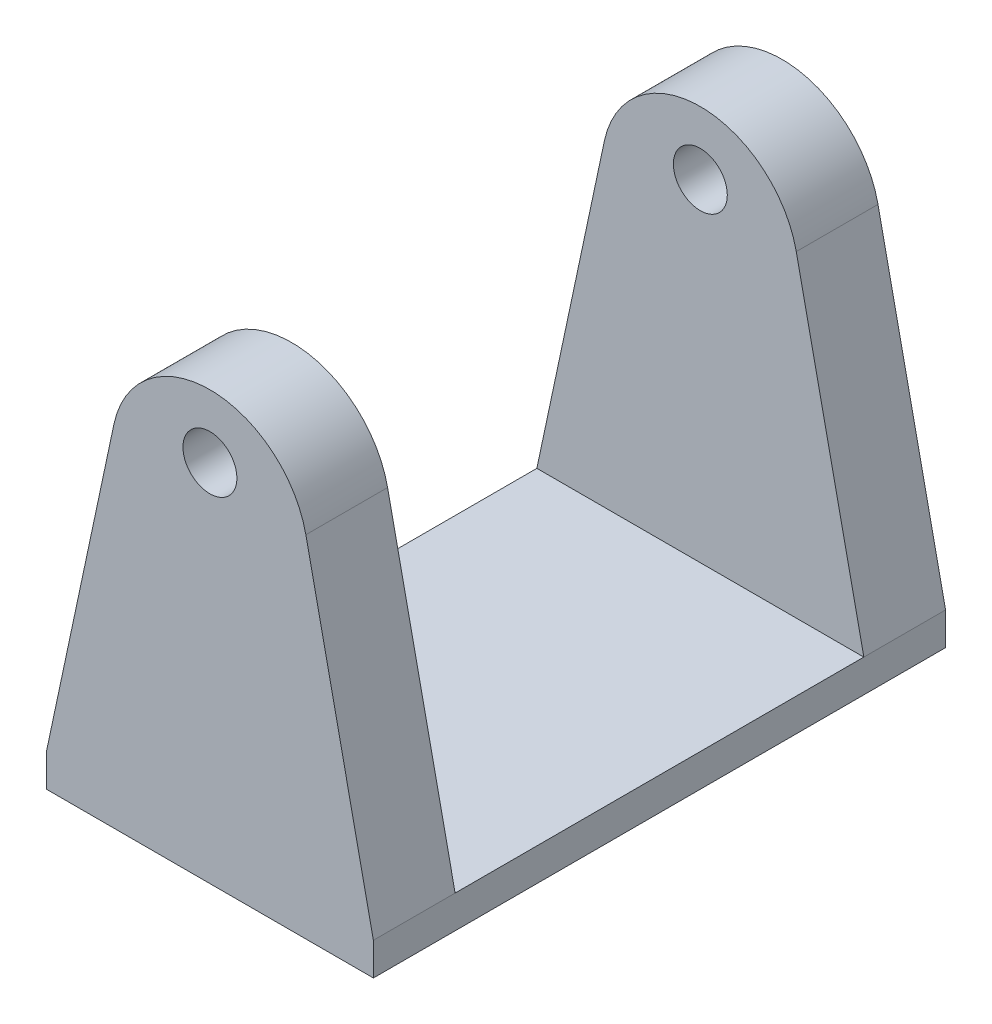
ISO-10303-21;
HEADER;
FILE_DESCRIPTION(('STEP AP214'),'2;1');
FILE_NAME('part.step','',(''),(''),'','','');
FILE_SCHEMA(('AUTOMOTIVE_DESIGN { 1 0 10303 214 1 1 1 1 }'));
ENDSEC;
DATA;
#1=APPLICATION_CONTEXT('core data for automotive mechanical design processes');
#2=APPLICATION_PROTOCOL_DEFINITION('international standard','automotive_design',2000,#1);
#3=PRODUCT_CONTEXT('',#1,'mechanical');
#4=PRODUCT('Part','Part','',(#3));
#5=PRODUCT_RELATED_PRODUCT_CATEGORY('part','',(#4));
#6=PRODUCT_DEFINITION_FORMATION('','',#4);
#7=PRODUCT_DEFINITION_CONTEXT('part definition',#1,'design');
#8=PRODUCT_DEFINITION('design','',#6,#7);
#9=PRODUCT_DEFINITION_SHAPE('','',#8);
#10=(LENGTH_UNIT() NAMED_UNIT(*) SI_UNIT(.MILLI.,.METRE.));
#11=(NAMED_UNIT(*) PLANE_ANGLE_UNIT() SI_UNIT($,.RADIAN.));
#12=(NAMED_UNIT(*) SI_UNIT($,.STERADIAN.) SOLID_ANGLE_UNIT());
#13=UNCERTAINTY_MEASURE_WITH_UNIT(LENGTH_MEASURE(1.E-05),#10,'distance_accuracy_value','');
#14=(GEOMETRIC_REPRESENTATION_CONTEXT(3) GLOBAL_UNCERTAINTY_ASSIGNED_CONTEXT((#13)) GLOBAL_UNIT_ASSIGNED_CONTEXT((#10,
#11,#12)) REPRESENTATION_CONTEXT('',''));
#15=CARTESIAN_POINT('',(0.,0.,0.));
#16=DIRECTION('',(0.,0.,1.));
#17=DIRECTION('',(1.,0.,0.));
#18=AXIS2_PLACEMENT_3D('',#15,#16,#17);
#19=CARTESIAN_POINT('',(0.,2.,0.));
#20=DIRECTION('',(0.,-1.,0.));
#21=DIRECTION('',(0.,0.,-1.));
#22=AXIS2_PLACEMENT_3D('',#19,#20,#21);
#23=PLANE('',#22);
#24=DIRECTION('',(1.,0.,0.));
#25=VECTOR('',#24,1.);
#26=CARTESIAN_POINT('',(0.,2.,-30.));
#27=LINE('',#26,#25);
#28=CARTESIAN_POINT('',(0.,2.,-30.));
#29=VERTEX_POINT('',#28);
#30=CARTESIAN_POINT('',(20.,2.,-30.));
#31=VERTEX_POINT('',#30);
#32=EDGE_CURVE('E147',#29,#31,#27,.T.);
#33=ORIENTED_EDGE('',*,*,#32,.F.);
#34=DIRECTION('',(0.,0.,1.));
#35=VECTOR('',#34,1.);
#36=CARTESIAN_POINT('',(0.,2.,0.));
#37=LINE('',#36,#35);
#38=CARTESIAN_POINT('',(0.,2.,-5.));
#39=VERTEX_POINT('',#38);
#40=EDGE_CURVE('E258',#29,#39,#37,.T.);
#41=ORIENTED_EDGE('',*,*,#40,.T.);
#42=DIRECTION('',(1.,0.,0.));
#43=VECTOR('',#42,1.);
#44=CARTESIAN_POINT('',(0.,2.,-5.));
#45=LINE('',#44,#43);
#46=CARTESIAN_POINT('',(20.,2.,-5.));
#47=VERTEX_POINT('',#46);
#48=EDGE_CURVE('E140',#39,#47,#45,.T.);
#49=ORIENTED_EDGE('',*,*,#48,.T.);
#50=DIRECTION('',(0.,0.,-1.));
#51=VECTOR('',#50,1.);
#52=CARTESIAN_POINT('',(20.,2.,0.));
#53=LINE('',#52,#51);
#54=EDGE_CURVE('E276',#47,#31,#53,.T.);
#55=ORIENTED_EDGE('',*,*,#54,.T.);
#56=EDGE_LOOP('',(#33,#41,#49,#55));
#57=FACE_BOUND('',#56,.T.);
#58=ADVANCED_FACE('F41',(#57),#23,.F.);
#59=CARTESIAN_POINT('',(0.,2.,0.));
#60=DIRECTION('',(1.,0.,0.));
#61=DIRECTION('',(0.,0.,-1.));
#62=AXIS2_PLACEMENT_3D('',#59,#60,#61);
#63=PLANE('',#62);
#64=DIRECTION('',(0.,0.,1.));
#65=VECTOR('',#64,1.);
#66=CARTESIAN_POINT('',(0.,0.,0.));
#67=LINE('',#66,#65);
#68=CARTESIAN_POINT('',(0.,0.,-35.));
#69=VERTEX_POINT('',#68);
#70=CARTESIAN_POINT('',(0.,0.,0.));
#71=VERTEX_POINT('',#70);
#72=EDGE_CURVE('E188',#69,#71,#67,.T.);
#73=ORIENTED_EDGE('',*,*,#72,.T.);
#74=DIRECTION('',(0.,-1.,0.));
#75=VECTOR('',#74,1.);
#76=CARTESIAN_POINT('',(0.,2.,0.));
#77=LINE('',#76,#75);
#78=CARTESIAN_POINT('',(0.,2.,0.));
#79=VERTEX_POINT('',#78);
#80=EDGE_CURVE('E208',#79,#71,#77,.T.);
#81=ORIENTED_EDGE('',*,*,#80,.F.);
#82=DIRECTION('',(0.,0.,-1.));
#83=VECTOR('',#82,1.);
#84=CARTESIAN_POINT('',(0.,2.,0.));
#85=LINE('',#84,#83);
#86=EDGE_CURVE('E236',#79,#39,#85,.T.);
#87=ORIENTED_EDGE('',*,*,#86,.T.);
#88=ORIENTED_EDGE('',*,*,#40,.F.);
#89=CARTESIAN_POINT('',(0.,2.,-35.));
#90=VERTEX_POINT('',#89);
#91=EDGE_CURVE('E254',#90,#29,#37,.T.);
#92=ORIENTED_EDGE('',*,*,#91,.F.);
#93=DIRECTION('',(0.,-1.,0.));
#94=VECTOR('',#93,1.);
#95=CARTESIAN_POINT('',(0.,2.,-35.));
#96=LINE('',#95,#94);
#97=EDGE_CURVE('E130',#90,#69,#96,.T.);
#98=ORIENTED_EDGE('',*,*,#97,.T.);
#99=EDGE_LOOP('',(#73,#81,#87,#88,#92,#98));
#100=FACE_BOUND('',#99,.T.);
#101=ADVANCED_FACE('F294',(#100),#63,.F.);
#102=CARTESIAN_POINT('',(0.,2.,0.));
#103=DIRECTION('',(0.,0.,-1.));
#104=DIRECTION('',(-1.,0.,0.));
#105=AXIS2_PLACEMENT_3D('',#102,#103,#104);
#106=PLANE('',#105);
#107=CARTESIAN_POINT('',(10.,22.3,0.));
#108=DIRECTION('',(0.,0.,-1.));
#109=DIRECTION('',(-1.,0.,0.));
#110=AXIS2_PLACEMENT_3D('',#107,#108,#109);
#111=CIRCLE('',#110,1.65);
#112=CARTESIAN_POINT('',(8.35,22.3,0.));
#113=VERTEX_POINT('',#112);
#114=EDGE_CURVE('E415',#113,#113,#111,.T.);
#115=ORIENTED_EDGE('',*,*,#114,.T.);
#116=EDGE_LOOP('',(#115));
#117=FACE_BOUND('',#116,.T.);
#118=DIRECTION('',(-0.208107644464859,0.978105928984836,0.));
#119=VECTOR('',#118,1.);
#120=CARTESIAN_POINT('',(20.,2.,0.));
#121=LINE('',#120,#119);
#122=CARTESIAN_POINT('',(20.,2.,0.));
#123=VERTEX_POINT('',#122);
#124=CARTESIAN_POINT('',(15.868635573909,21.4174128026276,0.));
#125=VERTEX_POINT('',#124);
#126=EDGE_CURVE('E184',#123,#125,#121,.T.);
#127=ORIENTED_EDGE('',*,*,#126,.T.);
#128=CARTESIAN_POINT('',(10.,20.1687669358385,0.));
#129=DIRECTION('',(0.,0.,-1.));
#130=DIRECTION('',(-1.,0.,0.));
#131=AXIS2_PLACEMENT_3D('',#128,#129,#130);
#132=CIRCLE('',#131,6.);
#133=CARTESIAN_POINT('',(4.13136442609099,21.4174128026276,0.));
#134=VERTEX_POINT('',#133);
#135=EDGE_CURVE('E172',#125,#134,#132,.F.);
#136=ORIENTED_EDGE('',*,*,#135,.T.);
#137=DIRECTION('',(-0.208107644464859,-0.978105928984835,0.));
#138=VECTOR('',#137,1.);
#139=CARTESIAN_POINT('',(10.,49.,0.));
#140=LINE('',#139,#138);
#141=EDGE_CURVE('E196',#134,#79,#140,.T.);
#142=ORIENTED_EDGE('',*,*,#141,.T.);
#143=ORIENTED_EDGE('',*,*,#80,.T.);
#144=DIRECTION('',(1.,0.,0.));
#145=VECTOR('',#144,1.);
#146=CARTESIAN_POINT('',(0.,0.,0.));
#147=LINE('',#146,#145);
#148=CARTESIAN_POINT('',(20.,0.,0.));
#149=VERTEX_POINT('',#148);
#150=EDGE_CURVE('E287',#71,#149,#147,.T.);
#151=ORIENTED_EDGE('',*,*,#150,.T.);
#152=DIRECTION('',(0.,-1.,0.));
#153=VECTOR('',#152,1.);
#154=CARTESIAN_POINT('',(20.,2.,0.));
#155=LINE('',#154,#153);
#156=EDGE_CURVE('E129',#123,#149,#155,.T.);
#157=ORIENTED_EDGE('',*,*,#156,.F.);
#158=EDGE_LOOP('',(#127,#136,#142,#143,#151,#157));
#159=FACE_BOUND('',#158,.T.);
#160=ADVANCED_FACE('F220',(#117,#159),#106,.F.);
#161=CARTESIAN_POINT('',(20.,2.,0.));
#162=DIRECTION('',(-1.,0.,0.));
#163=DIRECTION('',(0.,0.,1.));
#164=AXIS2_PLACEMENT_3D('',#161,#162,#163);
#165=PLANE('',#164);
#166=DIRECTION('',(0.,0.,-1.));
#167=VECTOR('',#166,1.);
#168=CARTESIAN_POINT('',(20.,0.,0.));
#169=LINE('',#168,#167);
#170=CARTESIAN_POINT('',(20.,0.,-35.));
#171=VERTEX_POINT('',#170);
#172=EDGE_CURVE('E125',#149,#171,#169,.T.);
#173=ORIENTED_EDGE('',*,*,#172,.T.);
#174=DIRECTION('',(0.,-1.,0.));
#175=VECTOR('',#174,1.);
#176=CARTESIAN_POINT('',(20.,2.,-35.));
#177=LINE('',#176,#175);
#178=CARTESIAN_POINT('',(20.,2.,-35.));
#179=VERTEX_POINT('',#178);
#180=EDGE_CURVE('E116',#179,#171,#177,.T.);
#181=ORIENTED_EDGE('',*,*,#180,.F.);
#182=DIRECTION('',(0.,0.,1.));
#183=VECTOR('',#182,1.);
#184=CARTESIAN_POINT('',(20.,2.,-35.));
#185=LINE('',#184,#183);
#186=EDGE_CURVE('E121',#179,#31,#185,.T.);
#187=ORIENTED_EDGE('',*,*,#186,.T.);
#188=ORIENTED_EDGE('',*,*,#54,.F.);
#189=EDGE_CURVE('E269',#123,#47,#53,.T.);
#190=ORIENTED_EDGE('',*,*,#189,.F.);
#191=ORIENTED_EDGE('',*,*,#156,.T.);
#192=EDGE_LOOP('',(#173,#181,#187,#188,#190,#191));
#193=FACE_BOUND('',#192,.T.);
#194=ADVANCED_FACE('F118',(#193),#165,.F.);
#195=CARTESIAN_POINT('',(0.,2.,-35.));
#196=DIRECTION('',(0.,0.,1.));
#197=DIRECTION('',(1.,0.,0.));
#198=AXIS2_PLACEMENT_3D('',#195,#196,#197);
#199=PLANE('',#198);
#200=CARTESIAN_POINT('',(10.,22.3,-35.));
#201=DIRECTION('',(0.,0.,1.));
#202=DIRECTION('',(1.,0.,0.));
#203=AXIS2_PLACEMENT_3D('',#200,#201,#202);
#204=CIRCLE('',#203,1.65);
#205=CARTESIAN_POINT('',(11.65,22.3,-35.));
#206=VERTEX_POINT('',#205);
#207=EDGE_CURVE('E154',#206,#206,#204,.T.);
#208=ORIENTED_EDGE('',*,*,#207,.T.);
#209=EDGE_LOOP('',(#208));
#210=FACE_BOUND('',#209,.T.);
#211=DIRECTION('',(-0.208107644464859,-0.978105928984836,0.));
#212=VECTOR('',#211,1.);
#213=CARTESIAN_POINT('',(10.,49.,-35.));
#214=LINE('',#213,#212);
#215=CARTESIAN_POINT('',(4.13136442609099,21.4174128026276,-35.));
#216=VERTEX_POINT('',#215);
#217=EDGE_CURVE('E151',#216,#90,#214,.T.);
#218=ORIENTED_EDGE('',*,*,#217,.F.);
#219=CARTESIAN_POINT('',(10.,20.1687669358385,-35.));
#220=DIRECTION('',(0.,0.,1.));
#221=DIRECTION('',(1.,0.,0.));
#222=AXIS2_PLACEMENT_3D('',#219,#220,#221);
#223=CIRCLE('',#222,6.);
#224=CARTESIAN_POINT('',(15.868635573909,21.4174128026276,-35.));
#225=VERTEX_POINT('',#224);
#226=EDGE_CURVE('E12',#216,#225,#223,.F.);
#227=ORIENTED_EDGE('',*,*,#226,.T.);
#228=DIRECTION('',(-0.208107644464859,0.978105928984835,0.));
#229=VECTOR('',#228,1.);
#230=CARTESIAN_POINT('',(20.,2.,-35.));
#231=LINE('',#230,#229);
#232=EDGE_CURVE('E133',#179,#225,#231,.T.);
#233=ORIENTED_EDGE('',*,*,#232,.F.);
#234=ORIENTED_EDGE('',*,*,#180,.T.);
#235=DIRECTION('',(-1.,0.,0.));
#236=VECTOR('',#235,1.);
#237=CARTESIAN_POINT('',(0.,0.,-35.));
#238=LINE('',#237,#236);
#239=EDGE_CURVE('E261',#171,#69,#238,.T.);
#240=ORIENTED_EDGE('',*,*,#239,.T.);
#241=ORIENTED_EDGE('',*,*,#97,.F.);
#242=EDGE_LOOP('',(#218,#227,#233,#234,#240,#241));
#243=FACE_BOUND('',#242,.T.);
#244=ADVANCED_FACE('F134',(#210,#243),#199,.F.);
#245=CARTESIAN_POINT('',(0.,0.,0.));
#246=DIRECTION('',(0.,-1.,0.));
#247=DIRECTION('',(0.,0.,-1.));
#248=AXIS2_PLACEMENT_3D('',#245,#246,#247);
#249=PLANE('',#248);
#250=ORIENTED_EDGE('',*,*,#72,.F.);
#251=ORIENTED_EDGE('',*,*,#239,.F.);
#252=ORIENTED_EDGE('',*,*,#172,.F.);
#253=ORIENTED_EDGE('',*,*,#150,.F.);
#254=EDGE_LOOP('',(#250,#251,#252,#253));
#255=FACE_BOUND('',#254,.T.);
#256=ADVANCED_FACE('F286',(#255),#249,.T.);
#257=CARTESIAN_POINT('',(0.,0.,-5.));
#258=DIRECTION('',(0.,0.,-1.));
#259=DIRECTION('',(-1.,0.,0.));
#260=AXIS2_PLACEMENT_3D('',#257,#258,#259);
#261=PLANE('',#260);
#262=CARTESIAN_POINT('',(10.,22.3,-5.));
#263=DIRECTION('',(0.,0.,-1.));
#264=DIRECTION('',(-1.,0.,0.));
#265=AXIS2_PLACEMENT_3D('',#262,#263,#264);
#266=CIRCLE('',#265,1.65);
#267=CARTESIAN_POINT('',(8.35,22.3,-5.));
#268=VERTEX_POINT('',#267);
#269=EDGE_CURVE('E412',#268,#268,#266,.T.);
#270=ORIENTED_EDGE('',*,*,#269,.F.);
#271=EDGE_LOOP('',(#270));
#272=FACE_BOUND('',#271,.T.);
#273=DIRECTION('',(-0.208107644464859,-0.978105928984835,0.));
#274=VECTOR('',#273,1.);
#275=CARTESIAN_POINT('',(10.,49.,-5.));
#276=LINE('',#275,#274);
#277=CARTESIAN_POINT('',(4.13136442609099,21.4174128026276,-5.));
#278=VERTEX_POINT('',#277);
#279=EDGE_CURVE('E200',#278,#39,#276,.T.);
#280=ORIENTED_EDGE('',*,*,#279,.F.);
#281=CARTESIAN_POINT('',(10.,20.1687669358385,-5.));
#282=DIRECTION('',(0.,0.,-1.));
#283=DIRECTION('',(-1.,0.,0.));
#284=AXIS2_PLACEMENT_3D('',#281,#282,#283);
#285=CIRCLE('',#284,6.);
#286=CARTESIAN_POINT('',(15.868635573909,21.4174128026276,-5.));
#287=VERTEX_POINT('',#286);
#288=EDGE_CURVE('E207',#278,#287,#285,.T.);
#289=ORIENTED_EDGE('',*,*,#288,.T.);
#290=DIRECTION('',(-0.208107644464859,0.978105928984836,0.));
#291=VECTOR('',#290,1.);
#292=CARTESIAN_POINT('',(20.,2.,-5.));
#293=LINE('',#292,#291);
#294=EDGE_CURVE('E189',#47,#287,#293,.T.);
#295=ORIENTED_EDGE('',*,*,#294,.F.);
#296=ORIENTED_EDGE('',*,*,#48,.F.);
#297=EDGE_LOOP('',(#280,#289,#295,#296));
#298=FACE_BOUND('',#297,.T.);
#299=ADVANCED_FACE('F232',(#272,#298),#261,.T.);
#300=CARTESIAN_POINT('',(10.,49.,0.));
#301=DIRECTION('',(0.978105928984836,-0.208107644464859,0.));
#302=DIRECTION('',(0.208107644464859,0.978105928984835,0.));
#303=AXIS2_PLACEMENT_3D('',#300,#301,#302);
#304=PLANE('',#303);
#305=ORIENTED_EDGE('',*,*,#141,.F.);
#306=DIRECTION('',(0.,0.,-1.));
#307=VECTOR('',#306,1.);
#308=CARTESIAN_POINT('',(4.13136442609099,21.4174128026276,0.));
#309=LINE('',#308,#307);
#310=EDGE_CURVE('E203',#134,#278,#309,.T.);
#311=ORIENTED_EDGE('',*,*,#310,.T.);
#312=ORIENTED_EDGE('',*,*,#279,.T.);
#313=ORIENTED_EDGE('',*,*,#86,.F.);
#314=EDGE_LOOP('',(#305,#311,#312,#313));
#315=FACE_BOUND('',#314,.T.);
#316=ADVANCED_FACE('F227',(#315),#304,.F.);
#317=CARTESIAN_POINT('',(20.,2.,0.));
#318=DIRECTION('',(-0.978105928984836,-0.208107644464859,0.));
#319=DIRECTION('',(0.208107644464859,-0.978105928984836,0.));
#320=AXIS2_PLACEMENT_3D('',#317,#318,#319);
#321=PLANE('',#320);
#322=ORIENTED_EDGE('',*,*,#294,.T.);
#323=DIRECTION('',(0.,0.,-1.));
#324=VECTOR('',#323,1.);
#325=CARTESIAN_POINT('',(15.868635573909,21.4174128026276,0.));
#326=LINE('',#325,#324);
#327=EDGE_CURVE('E175',#287,#125,#326,.F.);
#328=ORIENTED_EDGE('',*,*,#327,.T.);
#329=ORIENTED_EDGE('',*,*,#126,.F.);
#330=ORIENTED_EDGE('',*,*,#189,.T.);
#331=EDGE_LOOP('',(#322,#328,#329,#330));
#332=FACE_BOUND('',#331,.T.);
#333=ADVANCED_FACE('F214',(#332),#321,.F.);
#334=CARTESIAN_POINT('',(0.,0.,-30.));
#335=DIRECTION('',(0.,0.,-1.));
#336=DIRECTION('',(-1.,0.,0.));
#337=AXIS2_PLACEMENT_3D('',#334,#335,#336);
#338=PLANE('',#337);
#339=CARTESIAN_POINT('',(10.,22.3,-30.));
#340=DIRECTION('',(0.,0.,1.));
#341=DIRECTION('',(1.,0.,0.));
#342=AXIS2_PLACEMENT_3D('',#339,#340,#341);
#343=CIRCLE('',#342,1.65);
#344=CARTESIAN_POINT('',(11.65,22.3,-30.));
#345=VERTEX_POINT('',#344);
#346=EDGE_CURVE('E417',#345,#345,#343,.T.);
#347=ORIENTED_EDGE('',*,*,#346,.F.);
#348=EDGE_LOOP('',(#347));
#349=FACE_BOUND('',#348,.T.);
#350=DIRECTION('',(-0.208107644464859,0.978105928984835,0.));
#351=VECTOR('',#350,1.);
#352=CARTESIAN_POINT('',(20.,2.,-30.));
#353=LINE('',#352,#351);
#354=CARTESIAN_POINT('',(15.868635573909,21.4174128026276,-30.));
#355=VERTEX_POINT('',#354);
#356=EDGE_CURVE('E141',#31,#355,#353,.T.);
#357=ORIENTED_EDGE('',*,*,#356,.T.);
#358=CARTESIAN_POINT('',(10.,20.1687669358385,-30.));
#359=DIRECTION('',(0.,0.,-1.));
#360=DIRECTION('',(-1.,0.,0.));
#361=AXIS2_PLACEMENT_3D('',#358,#359,#360);
#362=CIRCLE('',#361,6.);
#363=CARTESIAN_POINT('',(4.13136442609099,21.4174128026276,-30.));
#364=VERTEX_POINT('',#363);
#365=EDGE_CURVE('E64',#355,#364,#362,.F.);
#366=ORIENTED_EDGE('',*,*,#365,.T.);
#367=DIRECTION('',(-0.208107644464859,-0.978105928984836,0.));
#368=VECTOR('',#367,1.);
#369=CARTESIAN_POINT('',(10.,49.,-30.));
#370=LINE('',#369,#368);
#371=EDGE_CURVE('E146',#364,#29,#370,.T.);
#372=ORIENTED_EDGE('',*,*,#371,.T.);
#373=ORIENTED_EDGE('',*,*,#32,.T.);
#374=EDGE_LOOP('',(#357,#366,#372,#373));
#375=FACE_BOUND('',#374,.T.);
#376=ADVANCED_FACE('F307',(#349,#375),#338,.F.);
#377=CARTESIAN_POINT('',(10.,49.,-35.));
#378=DIRECTION('',(-0.978105928984836,0.208107644464859,0.));
#379=DIRECTION('',(-0.208107644464859,-0.978105928984836,0.));
#380=AXIS2_PLACEMENT_3D('',#377,#378,#379);
#381=PLANE('',#380);
#382=ORIENTED_EDGE('',*,*,#371,.F.);
#383=DIRECTION('',(0.,0.,1.));
#384=VECTOR('',#383,1.);
#385=CARTESIAN_POINT('',(4.13136442609099,21.4174128026276,-35.));
#386=LINE('',#385,#384);
#387=EDGE_CURVE('E50',#364,#216,#386,.F.);
#388=ORIENTED_EDGE('',*,*,#387,.T.);
#389=ORIENTED_EDGE('',*,*,#217,.T.);
#390=ORIENTED_EDGE('',*,*,#91,.T.);
#391=EDGE_LOOP('',(#382,#388,#389,#390));
#392=FACE_BOUND('',#391,.T.);
#393=ADVANCED_FACE('F314',(#392),#381,.T.);
#394=CARTESIAN_POINT('',(20.,2.,-35.));
#395=DIRECTION('',(0.978105928984836,0.208107644464859,0.));
#396=DIRECTION('',(-0.208107644464859,0.978105928984836,0.));
#397=AXIS2_PLACEMENT_3D('',#394,#395,#396);
#398=PLANE('',#397);
#399=ORIENTED_EDGE('',*,*,#232,.T.);
#400=DIRECTION('',(0.,0.,1.));
#401=VECTOR('',#400,1.);
#402=CARTESIAN_POINT('',(15.868635573909,21.4174128026276,-35.));
#403=LINE('',#402,#401);
#404=EDGE_CURVE('E170',#225,#355,#403,.T.);
#405=ORIENTED_EDGE('',*,*,#404,.T.);
#406=ORIENTED_EDGE('',*,*,#356,.F.);
#407=ORIENTED_EDGE('',*,*,#186,.F.);
#408=EDGE_LOOP('',(#399,#405,#406,#407));
#409=FACE_BOUND('',#408,.T.);
#410=ADVANCED_FACE('F144',(#409),#398,.T.);
#411=CARTESIAN_POINT('',(10.,20.1687669358385,0.));
#412=DIRECTION('',(0.,0.,-1.));
#413=DIRECTION('',(-1.,0.,0.));
#414=AXIS2_PLACEMENT_3D('',#411,#412,#413);
#415=CYLINDRICAL_SURFACE('',#414,6.);
#416=ORIENTED_EDGE('',*,*,#135,.F.);
#417=ORIENTED_EDGE('',*,*,#327,.F.);
#418=ORIENTED_EDGE('',*,*,#288,.F.);
#419=ORIENTED_EDGE('',*,*,#310,.F.);
#420=EDGE_LOOP('',(#416,#417,#418,#419));
#421=FACE_BOUND('',#420,.T.);
#422=ADVANCED_FACE('F224',(#421),#415,.T.);
#423=CARTESIAN_POINT('',(10.,20.1687669358385,-35.));
#424=DIRECTION('',(0.,0.,1.));
#425=DIRECTION('',(1.,0.,0.));
#426=AXIS2_PLACEMENT_3D('',#423,#424,#425);
#427=CYLINDRICAL_SURFACE('',#426,6.);
#428=ORIENTED_EDGE('',*,*,#226,.F.);
#429=ORIENTED_EDGE('',*,*,#387,.F.);
#430=ORIENTED_EDGE('',*,*,#365,.F.);
#431=ORIENTED_EDGE('',*,*,#404,.F.);
#432=EDGE_LOOP('',(#428,#429,#430,#431));
#433=FACE_BOUND('',#432,.T.);
#434=ADVANCED_FACE('F43',(#433),#427,.T.);
#435=CARTESIAN_POINT('',(10.,22.3,-30.));
#436=DIRECTION('',(0.,0.,1.));
#437=DIRECTION('',(1.,0.,0.));
#438=AXIS2_PLACEMENT_3D('',#435,#436,#437);
#439=CYLINDRICAL_SURFACE('',#438,1.65);
#440=ORIENTED_EDGE('',*,*,#346,.T.);
#441=EDGE_LOOP('',(#440));
#442=FACE_BOUND('',#441,.T.);
#443=ORIENTED_EDGE('',*,*,#207,.F.);
#444=EDGE_LOOP('',(#443));
#445=FACE_BOUND('',#444,.T.);
#446=ADVANCED_FACE('F312',(#442,#445),#439,.F.);
#447=CARTESIAN_POINT('',(10.,22.3,-5.));
#448=DIRECTION('',(0.,0.,-1.));
#449=DIRECTION('',(-1.,0.,0.));
#450=AXIS2_PLACEMENT_3D('',#447,#448,#449);
#451=CYLINDRICAL_SURFACE('',#450,1.65);
#452=ORIENTED_EDGE('',*,*,#269,.T.);
#453=EDGE_LOOP('',(#452));
#454=FACE_BOUND('',#453,.T.);
#455=ORIENTED_EDGE('',*,*,#114,.F.);
#456=EDGE_LOOP('',(#455));
#457=FACE_BOUND('',#456,.T.);
#458=ADVANCED_FACE('F396',(#454,#457),#451,.F.);
#459=CLOSED_SHELL('',(#58,#101,#160,#194,#244,#256,#299,#316,#333,#376,#393,#410,#422,#434,#446,#458));
#460=MANIFOLD_SOLID_BREP('B2',#459);
#461=ADVANCED_BREP_SHAPE_REPRESENTATION('',(#18,#460),#14);
#462=SHAPE_DEFINITION_REPRESENTATION(#9,#461);
ENDSEC;
END-ISO-10303-21;
